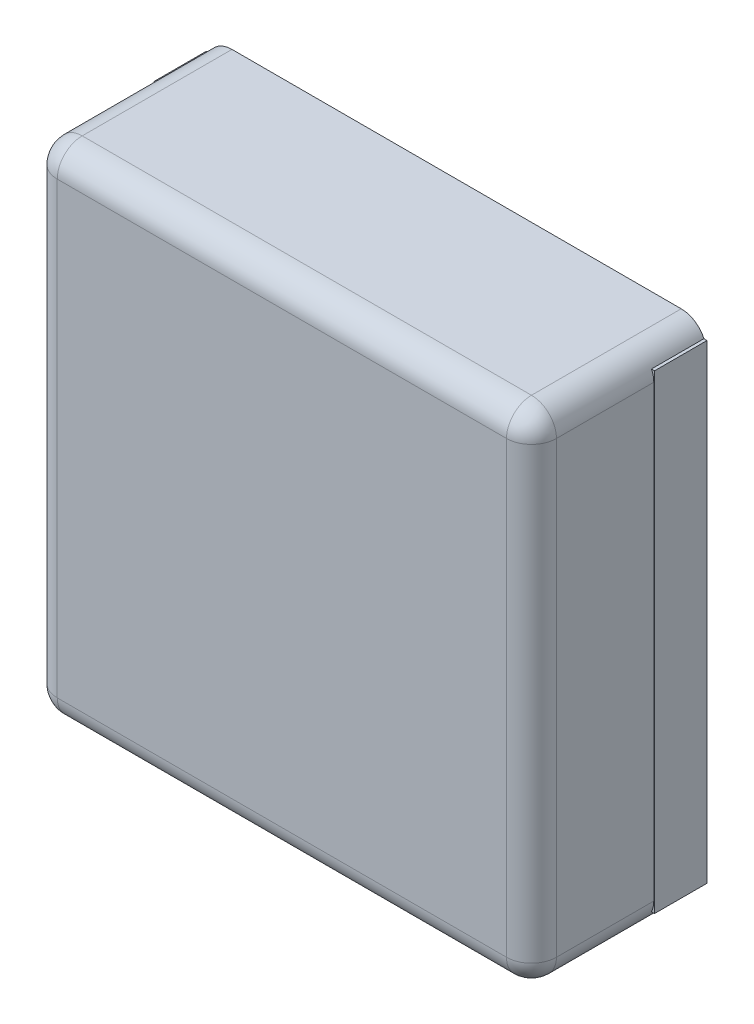
ISO-10303-21;
HEADER;
FILE_DESCRIPTION(('STEP AP214'),'2;1');
FILE_NAME('part.step','',(''),(''),'','','');
FILE_SCHEMA(('AUTOMOTIVE_DESIGN { 1 0 10303 214 1 1 1 1 }'));
ENDSEC;
DATA;
#1=APPLICATION_CONTEXT('core data for automotive mechanical design processes');
#2=APPLICATION_PROTOCOL_DEFINITION('international standard','automotive_design',2000,#1);
#3=PRODUCT_CONTEXT('',#1,'mechanical');
#4=PRODUCT('Part','Part','',(#3));
#5=PRODUCT_RELATED_PRODUCT_CATEGORY('part','',(#4));
#6=PRODUCT_DEFINITION_FORMATION('','',#4);
#7=PRODUCT_DEFINITION_CONTEXT('part definition',#1,'design');
#8=PRODUCT_DEFINITION('design','',#6,#7);
#9=PRODUCT_DEFINITION_SHAPE('','',#8);
#10=(LENGTH_UNIT() NAMED_UNIT(*) SI_UNIT(.MILLI.,.METRE.));
#11=(NAMED_UNIT(*) PLANE_ANGLE_UNIT() SI_UNIT($,.RADIAN.));
#12=(NAMED_UNIT(*) SI_UNIT($,.STERADIAN.) SOLID_ANGLE_UNIT());
#13=UNCERTAINTY_MEASURE_WITH_UNIT(LENGTH_MEASURE(1.E-05),#10,'distance_accuracy_value','');
#14=(GEOMETRIC_REPRESENTATION_CONTEXT(3) GLOBAL_UNCERTAINTY_ASSIGNED_CONTEXT((#13)) GLOBAL_UNIT_ASSIGNED_CONTEXT((#10,
#11,#12)) REPRESENTATION_CONTEXT('',''));
#15=CARTESIAN_POINT('',(0.,0.,0.));
#16=DIRECTION('',(0.,0.,1.));
#17=DIRECTION('',(1.,0.,0.));
#18=AXIS2_PLACEMENT_3D('',#15,#16,#17);
#19=CARTESIAN_POINT('',(3.01,-2.825,0.));
#20=DIRECTION('',(1.,0.,0.));
#21=DIRECTION('',(0.,1.,0.));
#22=AXIS2_PLACEMENT_3D('',#19,#20,#21);
#23=PLANE('',#22);
#24=DIRECTION('',(0.,0.,1.));
#25=VECTOR('',#24,1.);
#26=CARTESIAN_POINT('',(3.01,-2.825,0.));
#27=LINE('',#26,#25);
#28=CARTESIAN_POINT('',(3.01,-2.825,0.));
#29=VERTEX_POINT('',#28);
#30=CARTESIAN_POINT('',(3.01,-2.825,0.63));
#31=VERTEX_POINT('',#30);
#32=EDGE_CURVE('E322',#29,#31,#27,.T.);
#33=ORIENTED_EDGE('',*,*,#32,.F.);
#34=DIRECTION('',(0.,1.,0.));
#35=VECTOR('',#34,1.);
#36=CARTESIAN_POINT('',(3.01,-2.825,0.));
#37=LINE('',#36,#35);
#38=CARTESIAN_POINT('',(3.01,2.825,0.));
#39=VERTEX_POINT('',#38);
#40=EDGE_CURVE('E378',#29,#39,#37,.T.);
#41=ORIENTED_EDGE('',*,*,#40,.T.);
#42=DIRECTION('',(0.,0.,1.));
#43=VECTOR('',#42,1.);
#44=CARTESIAN_POINT('',(3.01,2.825,0.));
#45=LINE('',#44,#43);
#46=CARTESIAN_POINT('',(3.01,2.825,0.63));
#47=VERTEX_POINT('',#46);
#48=EDGE_CURVE('E11',#39,#47,#45,.T.);
#49=ORIENTED_EDGE('',*,*,#48,.T.);
#50=DIRECTION('',(0.,1.,0.));
#51=VECTOR('',#50,1.);
#52=CARTESIAN_POINT('',(3.01,-2.825,0.63));
#53=LINE('',#52,#51);
#54=EDGE_CURVE('E329',#31,#47,#53,.T.);
#55=ORIENTED_EDGE('',*,*,#54,.F.);
#56=EDGE_LOOP('',(#33,#41,#49,#55));
#57=FACE_BOUND('',#56,.T.);
#58=ADVANCED_FACE('F18',(#57),#23,.T.);
#59=CARTESIAN_POINT('',(1.16,2.825,0.));
#60=DIRECTION('',(0.,1.,0.));
#61=DIRECTION('',(1.,0.,0.));
#62=AXIS2_PLACEMENT_3D('',#59,#60,#61);
#63=PLANE('',#62);
#64=DIRECTION('',(1.,0.,0.));
#65=VECTOR('',#64,1.);
#66=CARTESIAN_POINT('',(1.16,2.825,0.));
#67=LINE('',#66,#65);
#68=CARTESIAN_POINT('',(2.972717802866,2.825,0.));
#69=VERTEX_POINT('',#68);
#70=EDGE_CURVE('E291',#69,#39,#67,.T.);
#71=ORIENTED_EDGE('',*,*,#70,.F.);
#72=DIRECTION('',(0.,0.,1.));
#73=VECTOR('',#72,1.);
#74=CARTESIAN_POINT('',(2.972717802866,2.825,0.));
#75=LINE('',#74,#73);
#76=CARTESIAN_POINT('',(2.972717802866,2.825,0.63));
#77=VERTEX_POINT('',#76);
#78=EDGE_CURVE('E292',#69,#77,#75,.T.);
#79=ORIENTED_EDGE('',*,*,#78,.T.);
#80=DIRECTION('',(1.,0.,0.));
#81=VECTOR('',#80,1.);
#82=CARTESIAN_POINT('',(1.16,2.825,0.63));
#83=LINE('',#82,#81);
#84=EDGE_CURVE('E29',#77,#47,#83,.T.);
#85=ORIENTED_EDGE('',*,*,#84,.T.);
#86=ORIENTED_EDGE('',*,*,#48,.F.);
#87=EDGE_LOOP('',(#71,#79,#85,#86));
#88=FACE_BOUND('',#87,.T.);
#89=ADVANCED_FACE('F457',(#88),#63,.T.);
#90=CARTESIAN_POINT('',(2.7,2.7,1.8));
#91=DIRECTION('',(0.,0.,1.));
#92=DIRECTION('',(0.,1.,0.));
#93=AXIS2_PLACEMENT_3D('',#90,#91,#92);
#94=SPHERICAL_SURFACE('',#93,0.3);
#95=CARTESIAN_POINT('',(2.7,2.7,1.8));
#96=DIRECTION('',(0.,-1.,0.));
#97=DIRECTION('',(1.,0.,0.));
#98=AXIS2_PLACEMENT_3D('',#95,#96,#97);
#99=CIRCLE('',#98,0.3);
#100=CARTESIAN_POINT('',(3.,2.7,1.8));
#101=VERTEX_POINT('',#100);
#102=CARTESIAN_POINT('',(2.7,2.7,2.1));
#103=VERTEX_POINT('',#102);
#104=EDGE_CURVE('E219',#101,#103,#99,.T.);
#105=ORIENTED_EDGE('',*,*,#104,.F.);
#106=CARTESIAN_POINT('',(2.7,2.7,1.8));
#107=DIRECTION('',(0.,0.,-1.));
#108=DIRECTION('',(0.,1.,0.));
#109=AXIS2_PLACEMENT_3D('',#106,#107,#108);
#110=CIRCLE('',#109,0.3);
#111=CARTESIAN_POINT('',(2.7,3.,1.8));
#112=VERTEX_POINT('',#111);
#113=EDGE_CURVE('E287',#112,#101,#110,.T.);
#114=ORIENTED_EDGE('',*,*,#113,.F.);
#115=CARTESIAN_POINT('',(2.7,2.7,1.8));
#116=DIRECTION('',(1.,0.,0.));
#117=DIRECTION('',(0.,1.,0.));
#118=AXIS2_PLACEMENT_3D('',#115,#116,#117);
#119=CIRCLE('',#118,0.3);
#120=EDGE_CURVE('E314',#112,#103,#119,.T.);
#121=ORIENTED_EDGE('',*,*,#120,.T.);
#122=EDGE_LOOP('',(#105,#114,#121));
#123=FACE_BOUND('',#122,.T.);
#124=ADVANCED_FACE('F516',(#123),#94,.T.);
#125=CARTESIAN_POINT('',(1.16,-2.825,0.63));
#126=DIRECTION('',(0.,0.,1.));
#127=DIRECTION('',(1.,0.,0.));
#128=AXIS2_PLACEMENT_3D('',#125,#126,#127);
#129=PLANE('',#128);
#130=CARTESIAN_POINT('',(2.7,-2.7,0.63));
#131=DIRECTION('',(0.,0.,1.));
#132=DIRECTION('',(1.,0.,0.));
#133=AXIS2_PLACEMENT_3D('',#130,#131,#132);
#134=CIRCLE('',#133,0.3);
#135=CARTESIAN_POINT('',(2.972717802866,-2.825,0.63));
#136=VERTEX_POINT('',#135);
#137=CARTESIAN_POINT('',(3.,-2.7,0.63));
#138=VERTEX_POINT('',#137);
#139=EDGE_CURVE('E227',#136,#138,#134,.T.);
#140=ORIENTED_EDGE('',*,*,#139,.F.);
#141=DIRECTION('',(1.,0.,0.));
#142=VECTOR('',#141,1.);
#143=CARTESIAN_POINT('',(1.16,-2.825,0.63));
#144=LINE('',#143,#142);
#145=EDGE_CURVE('E326',#136,#31,#144,.T.);
#146=ORIENTED_EDGE('',*,*,#145,.T.);
#147=ORIENTED_EDGE('',*,*,#54,.T.);
#148=ORIENTED_EDGE('',*,*,#84,.F.);
#149=CARTESIAN_POINT('',(2.7,2.7,0.63));
#150=DIRECTION('',(0.,0.,1.));
#151=DIRECTION('',(1.,0.,0.));
#152=AXIS2_PLACEMENT_3D('',#149,#150,#151);
#153=CIRCLE('',#152,0.3);
#154=CARTESIAN_POINT('',(3.,2.7,0.63));
#155=VERTEX_POINT('',#154);
#156=EDGE_CURVE('E308',#155,#77,#153,.T.);
#157=ORIENTED_EDGE('',*,*,#156,.F.);
#158=DIRECTION('',(0.,-1.,0.));
#159=VECTOR('',#158,1.);
#160=CARTESIAN_POINT('',(3.,-2.9125,0.63));
#161=LINE('',#160,#159);
#162=EDGE_CURVE('E206',#155,#138,#161,.T.);
#163=ORIENTED_EDGE('',*,*,#162,.T.);
#164=EDGE_LOOP('',(#140,#146,#147,#148,#157,#163));
#165=FACE_BOUND('',#164,.T.);
#166=ADVANCED_FACE('F482',(#165),#129,.T.);
#167=CARTESIAN_POINT('',(1.16,-2.825,0.));
#168=DIRECTION('',(0.,1.,0.));
#169=DIRECTION('',(1.,0.,0.));
#170=AXIS2_PLACEMENT_3D('',#167,#168,#169);
#171=PLANE('',#170);
#172=ORIENTED_EDGE('',*,*,#32,.T.);
#173=ORIENTED_EDGE('',*,*,#145,.F.);
#174=DIRECTION('',(0.,0.,1.));
#175=VECTOR('',#174,1.);
#176=CARTESIAN_POINT('',(2.972717802866,-2.825,0.));
#177=LINE('',#176,#175);
#178=CARTESIAN_POINT('',(2.972717802866,-2.825,0.));
#179=VERTEX_POINT('',#178);
#180=EDGE_CURVE('E234',#179,#136,#177,.T.);
#181=ORIENTED_EDGE('',*,*,#180,.F.);
#182=DIRECTION('',(1.,0.,0.));
#183=VECTOR('',#182,1.);
#184=CARTESIAN_POINT('',(1.16,-2.825,0.));
#185=LINE('',#184,#183);
#186=EDGE_CURVE('E393',#179,#29,#185,.T.);
#187=ORIENTED_EDGE('',*,*,#186,.T.);
#188=EDGE_LOOP('',(#172,#173,#181,#187));
#189=FACE_BOUND('',#188,.T.);
#190=ADVANCED_FACE('F478',(#189),#171,.F.);
#191=CARTESIAN_POINT('',(3.,-3.,0.));
#192=DIRECTION('',(1.,0.,0.));
#193=DIRECTION('',(0.,1.,0.));
#194=AXIS2_PLACEMENT_3D('',#191,#192,#193);
#195=PLANE('',#194);
#196=DIRECTION('',(0.,0.,1.));
#197=VECTOR('',#196,1.);
#198=CARTESIAN_POINT('',(3.,-2.7,0.));
#199=LINE('',#198,#197);
#200=CARTESIAN_POINT('',(3.,-2.7,1.8));
#201=VERTEX_POINT('',#200);
#202=EDGE_CURVE('E199',#138,#201,#199,.T.);
#203=ORIENTED_EDGE('',*,*,#202,.F.);
#204=ORIENTED_EDGE('',*,*,#162,.F.);
#205=DIRECTION('',(0.,0.,1.));
#206=VECTOR('',#205,1.);
#207=CARTESIAN_POINT('',(3.,2.7,0.));
#208=LINE('',#207,#206);
#209=EDGE_CURVE('E202',#155,#101,#208,.T.);
#210=ORIENTED_EDGE('',*,*,#209,.T.);
#211=DIRECTION('',(0.,-1.,0.));
#212=VECTOR('',#211,1.);
#213=CARTESIAN_POINT('',(3.,2.7,1.8));
#214=LINE('',#213,#212);
#215=EDGE_CURVE('E195',#101,#201,#214,.T.);
#216=ORIENTED_EDGE('',*,*,#215,.T.);
#217=EDGE_LOOP('',(#203,#204,#210,#216));
#218=FACE_BOUND('',#217,.T.);
#219=ADVANCED_FACE('F197',(#218),#195,.T.);
#220=CARTESIAN_POINT('',(2.7,-2.7,1.8));
#221=DIRECTION('',(0.,0.,1.));
#222=DIRECTION('',(1.,0.,0.));
#223=AXIS2_PLACEMENT_3D('',#220,#221,#222);
#224=SPHERICAL_SURFACE('',#223,0.3);
#225=CARTESIAN_POINT('',(2.7,-2.7,1.8));
#226=DIRECTION('',(-1.,0.,0.));
#227=DIRECTION('',(0.,-1.,0.));
#228=AXIS2_PLACEMENT_3D('',#225,#226,#227);
#229=CIRCLE('',#228,0.3);
#230=CARTESIAN_POINT('',(2.7,-3.,1.8));
#231=VERTEX_POINT('',#230);
#232=CARTESIAN_POINT('',(2.7,-2.7,2.1));
#233=VERTEX_POINT('',#232);
#234=EDGE_CURVE('E231',#231,#233,#229,.T.);
#235=ORIENTED_EDGE('',*,*,#234,.F.);
#236=CARTESIAN_POINT('',(2.7,-2.7,1.8));
#237=DIRECTION('',(0.,0.,-1.));
#238=DIRECTION('',(1.,0.,0.));
#239=AXIS2_PLACEMENT_3D('',#236,#237,#238);
#240=CIRCLE('',#239,0.3);
#241=EDGE_CURVE('E224',#201,#231,#240,.T.);
#242=ORIENTED_EDGE('',*,*,#241,.F.);
#243=CARTESIAN_POINT('',(2.7,-2.7,1.8));
#244=DIRECTION('',(0.,-1.,0.));
#245=DIRECTION('',(1.,0.,0.));
#246=AXIS2_PLACEMENT_3D('',#243,#244,#245);
#247=CIRCLE('',#246,0.3);
#248=EDGE_CURVE('E207',#201,#233,#247,.T.);
#249=ORIENTED_EDGE('',*,*,#248,.T.);
#250=EDGE_LOOP('',(#235,#242,#249));
#251=FACE_BOUND('',#250,.T.);
#252=ADVANCED_FACE('F230',(#251),#224,.T.);
#253=CARTESIAN_POINT('',(2.7,2.7,1.8));
#254=DIRECTION('',(0.,-1.,0.));
#255=DIRECTION('',(1.,0.,0.));
#256=AXIS2_PLACEMENT_3D('',#253,#254,#255);
#257=CYLINDRICAL_SURFACE('',#256,0.3);
#258=ORIENTED_EDGE('',*,*,#104,.T.);
#259=DIRECTION('',(0.,-1.,0.));
#260=VECTOR('',#259,1.);
#261=CARTESIAN_POINT('',(2.7,2.7,2.1));
#262=LINE('',#261,#260);
#263=EDGE_CURVE('E212',#103,#233,#262,.T.);
#264=ORIENTED_EDGE('',*,*,#263,.T.);
#265=ORIENTED_EDGE('',*,*,#248,.F.);
#266=ORIENTED_EDGE('',*,*,#215,.F.);
#267=EDGE_LOOP('',(#258,#264,#265,#266));
#268=FACE_BOUND('',#267,.T.);
#269=ADVANCED_FACE('F210',(#268),#257,.T.);
#270=CARTESIAN_POINT('',(-2.7,2.7,1.8));
#271=DIRECTION('',(1.,0.,0.));
#272=DIRECTION('',(0.,1.,0.));
#273=AXIS2_PLACEMENT_3D('',#270,#271,#272);
#274=CYLINDRICAL_SURFACE('',#273,0.3);
#275=CARTESIAN_POINT('',(-2.7,2.7,1.8));
#276=DIRECTION('',(1.,0.,0.));
#277=DIRECTION('',(0.,1.,0.));
#278=AXIS2_PLACEMENT_3D('',#275,#276,#277);
#279=CIRCLE('',#278,0.3);
#280=CARTESIAN_POINT('',(-2.7,3.,1.8));
#281=VERTEX_POINT('',#280);
#282=CARTESIAN_POINT('',(-2.7,2.7,2.1));
#283=VERTEX_POINT('',#282);
#284=EDGE_CURVE('E22',#281,#283,#279,.T.);
#285=ORIENTED_EDGE('',*,*,#284,.T.);
#286=DIRECTION('',(1.,0.,0.));
#287=VECTOR('',#286,1.);
#288=CARTESIAN_POINT('',(-2.7,2.7,2.1));
#289=LINE('',#288,#287);
#290=EDGE_CURVE('E265',#283,#103,#289,.T.);
#291=ORIENTED_EDGE('',*,*,#290,.T.);
#292=ORIENTED_EDGE('',*,*,#120,.F.);
#293=DIRECTION('',(1.,0.,0.));
#294=VECTOR('',#293,1.);
#295=CARTESIAN_POINT('',(-2.7,3.,1.8));
#296=LINE('',#295,#294);
#297=EDGE_CURVE('E258',#281,#112,#296,.T.);
#298=ORIENTED_EDGE('',*,*,#297,.F.);
#299=EDGE_LOOP('',(#285,#291,#292,#298));
#300=FACE_BOUND('',#299,.T.);
#301=ADVANCED_FACE('F445',(#300),#274,.T.);
#302=CARTESIAN_POINT('',(1.16,-2.825,0.));
#303=DIRECTION('',(0.,0.,1.));
#304=DIRECTION('',(1.,0.,0.));
#305=AXIS2_PLACEMENT_3D('',#302,#303,#304);
#306=PLANE('',#305);
#307=DIRECTION('',(1.,0.,0.));
#308=VECTOR('',#307,1.);
#309=CARTESIAN_POINT('',(1.16,2.825,0.));
#310=LINE('',#309,#308);
#311=CARTESIAN_POINT('',(1.16,2.825,0.));
#312=VERTEX_POINT('',#311);
#313=EDGE_CURVE('E267',#312,#69,#310,.T.);
#314=ORIENTED_EDGE('',*,*,#313,.T.);
#315=ORIENTED_EDGE('',*,*,#70,.T.);
#316=ORIENTED_EDGE('',*,*,#40,.F.);
#317=ORIENTED_EDGE('',*,*,#186,.F.);
#318=DIRECTION('',(1.,0.,0.));
#319=VECTOR('',#318,1.);
#320=CARTESIAN_POINT('',(1.16,-2.825,0.));
#321=LINE('',#320,#319);
#322=CARTESIAN_POINT('',(1.16,-2.825,0.));
#323=VERTEX_POINT('',#322);
#324=EDGE_CURVE('E799',#323,#179,#321,.T.);
#325=ORIENTED_EDGE('',*,*,#324,.F.);
#326=DIRECTION('',(0.,1.,0.));
#327=VECTOR('',#326,1.);
#328=CARTESIAN_POINT('',(1.16,-2.825,0.));
#329=LINE('',#328,#327);
#330=EDGE_CURVE('E270',#323,#312,#329,.T.);
#331=ORIENTED_EDGE('',*,*,#330,.T.);
#332=EDGE_LOOP('',(#314,#315,#316,#317,#325,#331));
#333=FACE_BOUND('',#332,.T.);
#334=ADVANCED_FACE('F493',(#333),#306,.F.);
#335=CARTESIAN_POINT('',(2.7,2.7,0.));
#336=DIRECTION('',(0.,0.,1.));
#337=DIRECTION('',(1.,0.,0.));
#338=AXIS2_PLACEMENT_3D('',#335,#336,#337);
#339=CYLINDRICAL_SURFACE('',#338,0.3);
#340=ORIENTED_EDGE('',*,*,#209,.F.);
#341=ORIENTED_EDGE('',*,*,#156,.T.);
#342=ORIENTED_EDGE('',*,*,#78,.F.);
#343=CARTESIAN_POINT('',(2.7,2.7,0.));
#344=DIRECTION('',(0.,0.,1.));
#345=DIRECTION('',(0.,-1.,0.));
#346=AXIS2_PLACEMENT_3D('',#343,#344,#345);
#347=CIRCLE('',#346,0.3);
#348=CARTESIAN_POINT('',(2.7,3.,0.));
#349=VERTEX_POINT('',#348);
#350=EDGE_CURVE('E271',#69,#349,#347,.T.);
#351=ORIENTED_EDGE('',*,*,#350,.T.);
#352=DIRECTION('',(0.,0.,1.));
#353=VECTOR('',#352,1.);
#354=CARTESIAN_POINT('',(2.7,3.,0.));
#355=LINE('',#354,#353);
#356=EDGE_CURVE('E262',#349,#112,#355,.T.);
#357=ORIENTED_EDGE('',*,*,#356,.T.);
#358=ORIENTED_EDGE('',*,*,#113,.T.);
#359=EDGE_LOOP('',(#340,#341,#342,#351,#357,#358));
#360=FACE_BOUND('',#359,.T.);
#361=ADVANCED_FACE('F488',(#360),#339,.T.);
#362=CARTESIAN_POINT('',(-3.01,-2.825,0.));
#363=DIRECTION('',(0.,0.,1.));
#364=DIRECTION('',(1.,0.,0.));
#365=AXIS2_PLACEMENT_3D('',#362,#363,#364);
#366=PLANE('',#365);
#367=DIRECTION('',(1.,0.,0.));
#368=VECTOR('',#367,1.);
#369=CARTESIAN_POINT('',(-3.01,2.825,0.));
#370=LINE('',#369,#368);
#371=CARTESIAN_POINT('',(-3.01,2.825,0.));
#372=VERTEX_POINT('',#371);
#373=CARTESIAN_POINT('',(-2.972717802866,2.825,0.));
#374=VERTEX_POINT('',#373);
#375=EDGE_CURVE('E246',#372,#374,#370,.T.);
#376=ORIENTED_EDGE('',*,*,#375,.T.);
#377=DIRECTION('',(1.,0.,0.));
#378=VECTOR('',#377,1.);
#379=CARTESIAN_POINT('',(-3.01,2.825,0.));
#380=LINE('',#379,#378);
#381=CARTESIAN_POINT('',(-1.16,2.825,0.));
#382=VERTEX_POINT('',#381);
#383=EDGE_CURVE('E298',#374,#382,#380,.T.);
#384=ORIENTED_EDGE('',*,*,#383,.T.);
#385=DIRECTION('',(0.,1.,0.));
#386=VECTOR('',#385,1.);
#387=CARTESIAN_POINT('',(-1.16,-2.825,0.));
#388=LINE('',#387,#386);
#389=CARTESIAN_POINT('',(-1.16,-2.825,0.));
#390=VERTEX_POINT('',#389);
#391=EDGE_CURVE('E296',#390,#382,#388,.T.);
#392=ORIENTED_EDGE('',*,*,#391,.F.);
#393=DIRECTION('',(1.,0.,0.));
#394=VECTOR('',#393,1.);
#395=CARTESIAN_POINT('',(-3.01,-2.825,0.));
#396=LINE('',#395,#394);
#397=CARTESIAN_POINT('',(-2.972717802866,-2.825,0.));
#398=VERTEX_POINT('',#397);
#399=EDGE_CURVE('E257',#398,#390,#396,.T.);
#400=ORIENTED_EDGE('',*,*,#399,.F.);
#401=DIRECTION('',(1.,0.,0.));
#402=VECTOR('',#401,1.);
#403=CARTESIAN_POINT('',(-3.01,-2.825,0.));
#404=LINE('',#403,#402);
#405=CARTESIAN_POINT('',(-3.01,-2.825,0.));
#406=VERTEX_POINT('',#405);
#407=EDGE_CURVE('E256',#406,#398,#404,.T.);
#408=ORIENTED_EDGE('',*,*,#407,.F.);
#409=DIRECTION('',(0.,1.,0.));
#410=VECTOR('',#409,1.);
#411=CARTESIAN_POINT('',(-3.01,-2.825,0.));
#412=LINE('',#411,#410);
#413=EDGE_CURVE('E242',#406,#372,#412,.T.);
#414=ORIENTED_EDGE('',*,*,#413,.T.);
#415=EDGE_LOOP('',(#376,#384,#392,#400,#408,#414));
#416=FACE_BOUND('',#415,.T.);
#417=ADVANCED_FACE('F492',(#416),#366,.F.);
#418=CARTESIAN_POINT('',(2.7,-2.7,0.));
#419=DIRECTION('',(0.,0.,1.));
#420=DIRECTION('',(1.,0.,0.));
#421=AXIS2_PLACEMENT_3D('',#418,#419,#420);
#422=CYLINDRICAL_SURFACE('',#421,0.3);
#423=ORIENTED_EDGE('',*,*,#241,.T.);
#424=DIRECTION('',(0.,0.,1.));
#425=VECTOR('',#424,1.);
#426=CARTESIAN_POINT('',(2.7,-3.,0.));
#427=LINE('',#426,#425);
#428=CARTESIAN_POINT('',(2.7,-3.,0.));
#429=VERTEX_POINT('',#428);
#430=EDGE_CURVE('E297',#429,#231,#427,.T.);
#431=ORIENTED_EDGE('',*,*,#430,.F.);
#432=CARTESIAN_POINT('',(2.7,-2.7,0.));
#433=DIRECTION('',(0.,0.,-1.));
#434=DIRECTION('',(0.,-1.,0.));
#435=AXIS2_PLACEMENT_3D('',#432,#433,#434);
#436=CIRCLE('',#435,0.3);
#437=EDGE_CURVE('E368',#179,#429,#436,.T.);
#438=ORIENTED_EDGE('',*,*,#437,.F.);
#439=ORIENTED_EDGE('',*,*,#180,.T.);
#440=ORIENTED_EDGE('',*,*,#139,.T.);
#441=ORIENTED_EDGE('',*,*,#202,.T.);
#442=EDGE_LOOP('',(#423,#431,#438,#439,#440,#441));
#443=FACE_BOUND('',#442,.T.);
#444=ADVANCED_FACE('F222',(#443),#422,.T.);
#445=CARTESIAN_POINT('',(2.7,-2.7,1.8));
#446=DIRECTION('',(-1.,0.,0.));
#447=DIRECTION('',(0.,-1.,0.));
#448=AXIS2_PLACEMENT_3D('',#445,#446,#447);
#449=CYLINDRICAL_SURFACE('',#448,0.3);
#450=ORIENTED_EDGE('',*,*,#234,.T.);
#451=DIRECTION('',(-1.,0.,0.));
#452=VECTOR('',#451,1.);
#453=CARTESIAN_POINT('',(2.7,-2.7,2.1));
#454=LINE('',#453,#452);
#455=CARTESIAN_POINT('',(-2.7,-2.7,2.1));
#456=VERTEX_POINT('',#455);
#457=EDGE_CURVE('E266',#233,#456,#454,.T.);
#458=ORIENTED_EDGE('',*,*,#457,.T.);
#459=CARTESIAN_POINT('',(-2.7,-2.7,1.8));
#460=DIRECTION('',(-1.,0.,0.));
#461=DIRECTION('',(0.,-1.,0.));
#462=AXIS2_PLACEMENT_3D('',#459,#460,#461);
#463=CIRCLE('',#462,0.3);
#464=CARTESIAN_POINT('',(-2.7,-3.,1.8));
#465=VERTEX_POINT('',#464);
#466=EDGE_CURVE('E310',#465,#456,#463,.T.);
#467=ORIENTED_EDGE('',*,*,#466,.F.);
#468=DIRECTION('',(-1.,0.,0.));
#469=VECTOR('',#468,1.);
#470=CARTESIAN_POINT('',(2.7,-3.,1.8));
#471=LINE('',#470,#469);
#472=EDGE_CURVE('E293',#231,#465,#471,.T.);
#473=ORIENTED_EDGE('',*,*,#472,.F.);
#474=EDGE_LOOP('',(#450,#458,#467,#473));
#475=FACE_BOUND('',#474,.T.);
#476=ADVANCED_FACE('F543',(#475),#449,.T.);
#477=CARTESIAN_POINT('',(-3.01,-2.825,0.));
#478=DIRECTION('',(1.,0.,0.));
#479=DIRECTION('',(0.,1.,0.));
#480=AXIS2_PLACEMENT_3D('',#477,#478,#479);
#481=PLANE('',#480);
#482=DIRECTION('',(0.,1.,0.));
#483=VECTOR('',#482,1.);
#484=CARTESIAN_POINT('',(-3.01,-2.825,0.63));
#485=LINE('',#484,#483);
#486=CARTESIAN_POINT('',(-3.01,-2.825,0.63));
#487=VERTEX_POINT('',#486);
#488=CARTESIAN_POINT('',(-3.01,2.825,0.63));
#489=VERTEX_POINT('',#488);
#490=EDGE_CURVE('E248',#487,#489,#485,.T.);
#491=ORIENTED_EDGE('',*,*,#490,.T.);
#492=DIRECTION('',(0.,0.,1.));
#493=VECTOR('',#492,1.);
#494=CARTESIAN_POINT('',(-3.01,2.825,0.));
#495=LINE('',#494,#493);
#496=EDGE_CURVE('E388',#372,#489,#495,.T.);
#497=ORIENTED_EDGE('',*,*,#496,.F.);
#498=ORIENTED_EDGE('',*,*,#413,.F.);
#499=DIRECTION('',(0.,0.,1.));
#500=VECTOR('',#499,1.);
#501=CARTESIAN_POINT('',(-3.01,-2.825,0.));
#502=LINE('',#501,#500);
#503=EDGE_CURVE('E253',#406,#487,#502,.T.);
#504=ORIENTED_EDGE('',*,*,#503,.T.);
#505=EDGE_LOOP('',(#491,#497,#498,#504));
#506=FACE_BOUND('',#505,.T.);
#507=ADVANCED_FACE('F547',(#506),#481,.F.);
#508=CARTESIAN_POINT('',(-3.01,2.825,0.));
#509=DIRECTION('',(0.,1.,0.));
#510=DIRECTION('',(1.,0.,0.));
#511=AXIS2_PLACEMENT_3D('',#508,#509,#510);
#512=PLANE('',#511);
#513=ORIENTED_EDGE('',*,*,#375,.F.);
#514=ORIENTED_EDGE('',*,*,#496,.T.);
#515=DIRECTION('',(1.,0.,0.));
#516=VECTOR('',#515,1.);
#517=CARTESIAN_POINT('',(-3.01,2.825,0.63));
#518=LINE('',#517,#516);
#519=CARTESIAN_POINT('',(-2.972717802866,2.825,0.63));
#520=VERTEX_POINT('',#519);
#521=EDGE_CURVE('E252',#489,#520,#518,.T.);
#522=ORIENTED_EDGE('',*,*,#521,.T.);
#523=DIRECTION('',(0.,0.,1.));
#524=VECTOR('',#523,1.);
#525=CARTESIAN_POINT('',(-2.972717802866,2.825,0.));
#526=LINE('',#525,#524);
#527=EDGE_CURVE('E281',#374,#520,#526,.T.);
#528=ORIENTED_EDGE('',*,*,#527,.F.);
#529=EDGE_LOOP('',(#513,#514,#522,#528));
#530=FACE_BOUND('',#529,.T.);
#531=ADVANCED_FACE('F571',(#530),#512,.T.);
#532=CARTESIAN_POINT('',(-3.,3.,0.));
#533=DIRECTION('',(0.,1.,0.));
#534=DIRECTION('',(1.,0.,0.));
#535=AXIS2_PLACEMENT_3D('',#532,#533,#534);
#536=PLANE('',#535);
#537=DIRECTION('',(0.,0.,1.));
#538=VECTOR('',#537,1.);
#539=CARTESIAN_POINT('',(-2.7,3.,0.));
#540=LINE('',#539,#538);
#541=CARTESIAN_POINT('',(-2.7,3.,0.));
#542=VERTEX_POINT('',#541);
#543=EDGE_CURVE('E334',#542,#281,#540,.T.);
#544=ORIENTED_EDGE('',*,*,#543,.T.);
#545=ORIENTED_EDGE('',*,*,#297,.T.);
#546=ORIENTED_EDGE('',*,*,#356,.F.);
#547=DIRECTION('',(1.,0.,0.));
#548=VECTOR('',#547,1.);
#549=CARTESIAN_POINT('',(-3.,3.,0.));
#550=LINE('',#549,#548);
#551=EDGE_CURVE('E301',#542,#349,#550,.T.);
#552=ORIENTED_EDGE('',*,*,#551,.F.);
#553=EDGE_LOOP('',(#544,#545,#546,#552));
#554=FACE_BOUND('',#553,.T.);
#555=ADVANCED_FACE('F647',(#554),#536,.T.);
#556=CARTESIAN_POINT('',(-2.7,2.7,1.8));
#557=DIRECTION('',(0.,0.,1.));
#558=DIRECTION('',(-1.,0.,0.));
#559=AXIS2_PLACEMENT_3D('',#556,#557,#558);
#560=SPHERICAL_SURFACE('',#559,0.3);
#561=ORIENTED_EDGE('',*,*,#284,.F.);
#562=CARTESIAN_POINT('',(-2.7,2.7,1.8));
#563=DIRECTION('',(0.,0.,-1.));
#564=DIRECTION('',(-1.,0.,0.));
#565=AXIS2_PLACEMENT_3D('',#562,#563,#564);
#566=CIRCLE('',#565,0.3);
#567=CARTESIAN_POINT('',(-3.,2.7,1.8));
#568=VERTEX_POINT('',#567);
#569=EDGE_CURVE('E353',#568,#281,#566,.T.);
#570=ORIENTED_EDGE('',*,*,#569,.F.);
#571=CARTESIAN_POINT('',(-2.7,2.7,1.8));
#572=DIRECTION('',(0.,1.,0.));
#573=DIRECTION('',(-1.,0.,0.));
#574=AXIS2_PLACEMENT_3D('',#571,#572,#573);
#575=CIRCLE('',#574,0.3);
#576=EDGE_CURVE('E277',#568,#283,#575,.T.);
#577=ORIENTED_EDGE('',*,*,#576,.T.);
#578=EDGE_LOOP('',(#561,#570,#577));
#579=FACE_BOUND('',#578,.T.);
#580=ADVANCED_FACE('F20',(#579),#560,.T.);
#581=CARTESIAN_POINT('',(-3.,-3.,2.1));
#582=DIRECTION('',(0.,0.,1.));
#583=DIRECTION('',(1.,0.,0.));
#584=AXIS2_PLACEMENT_3D('',#581,#582,#583);
#585=PLANE('',#584);
#586=DIRECTION('',(0.,1.,0.));
#587=VECTOR('',#586,1.);
#588=CARTESIAN_POINT('',(-2.7,-2.7,2.1));
#589=LINE('',#588,#587);
#590=EDGE_CURVE('E273',#456,#283,#589,.T.);
#591=ORIENTED_EDGE('',*,*,#590,.F.);
#592=ORIENTED_EDGE('',*,*,#457,.F.);
#593=ORIENTED_EDGE('',*,*,#263,.F.);
#594=ORIENTED_EDGE('',*,*,#290,.F.);
#595=EDGE_LOOP('',(#591,#592,#593,#594));
#596=FACE_BOUND('',#595,.T.);
#597=ADVANCED_FACE('F443',(#596),#585,.T.);
#598=CARTESIAN_POINT('',(-3.01,-2.825,0.));
#599=DIRECTION('',(0.,1.,0.));
#600=DIRECTION('',(1.,0.,0.));
#601=AXIS2_PLACEMENT_3D('',#598,#599,#600);
#602=PLANE('',#601);
#603=DIRECTION('',(0.,0.,1.));
#604=VECTOR('',#603,1.);
#605=CARTESIAN_POINT('',(-2.972717802866,-2.825,0.));
#606=LINE('',#605,#604);
#607=CARTESIAN_POINT('',(-2.972717802866,-2.825,0.63));
#608=VERTEX_POINT('',#607);
#609=EDGE_CURVE('E430',#398,#608,#606,.T.);
#610=ORIENTED_EDGE('',*,*,#609,.T.);
#611=DIRECTION('',(1.,0.,0.));
#612=VECTOR('',#611,1.);
#613=CARTESIAN_POINT('',(-3.01,-2.825,0.63));
#614=LINE('',#613,#612);
#615=EDGE_CURVE('E251',#487,#608,#614,.T.);
#616=ORIENTED_EDGE('',*,*,#615,.F.);
#617=ORIENTED_EDGE('',*,*,#503,.F.);
#618=ORIENTED_EDGE('',*,*,#407,.T.);
#619=EDGE_LOOP('',(#610,#616,#617,#618));
#620=FACE_BOUND('',#619,.T.);
#621=ADVANCED_FACE('F466',(#620),#602,.F.);
#622=CARTESIAN_POINT('',(-3.,-3.,0.));
#623=DIRECTION('',(0.,0.,1.));
#624=DIRECTION('',(1.,0.,0.));
#625=AXIS2_PLACEMENT_3D('',#622,#623,#624);
#626=PLANE('',#625);
#627=ORIENTED_EDGE('',*,*,#391,.T.);
#628=ORIENTED_EDGE('',*,*,#383,.F.);
#629=CARTESIAN_POINT('',(-2.7,2.7,0.));
#630=DIRECTION('',(0.,0.,-1.));
#631=DIRECTION('',(0.,-1.,0.));
#632=AXIS2_PLACEMENT_3D('',#629,#630,#631);
#633=CIRCLE('',#632,0.3);
#634=EDGE_CURVE('E330',#374,#542,#633,.T.);
#635=ORIENTED_EDGE('',*,*,#634,.T.);
#636=ORIENTED_EDGE('',*,*,#551,.T.);
#637=ORIENTED_EDGE('',*,*,#350,.F.);
#638=ORIENTED_EDGE('',*,*,#313,.F.);
#639=ORIENTED_EDGE('',*,*,#330,.F.);
#640=ORIENTED_EDGE('',*,*,#324,.T.);
#641=ORIENTED_EDGE('',*,*,#437,.T.);
#642=DIRECTION('',(1.,0.,0.));
#643=VECTOR('',#642,1.);
#644=CARTESIAN_POINT('',(-3.,-3.,0.));
#645=LINE('',#644,#643);
#646=CARTESIAN_POINT('',(-2.7,-3.,0.));
#647=VERTEX_POINT('',#646);
#648=EDGE_CURVE('E375',#647,#429,#645,.T.);
#649=ORIENTED_EDGE('',*,*,#648,.F.);
#650=CARTESIAN_POINT('',(-2.7,-2.7,0.));
#651=DIRECTION('',(0.,0.,1.));
#652=DIRECTION('',(0.,-1.,0.));
#653=AXIS2_PLACEMENT_3D('',#650,#651,#652);
#654=CIRCLE('',#653,0.3);
#655=EDGE_CURVE('E794',#398,#647,#654,.T.);
#656=ORIENTED_EDGE('',*,*,#655,.F.);
#657=ORIENTED_EDGE('',*,*,#399,.T.);
#658=EDGE_LOOP('',(#627,#628,#635,#636,#637,#638,#639,#640,#641,#649,#656,#657));
#659=FACE_BOUND('',#658,.T.);
#660=ADVANCED_FACE('F607',(#659),#626,.F.);
#661=CARTESIAN_POINT('',(-3.,-3.,0.));
#662=DIRECTION('',(0.,1.,0.));
#663=DIRECTION('',(1.,0.,0.));
#664=AXIS2_PLACEMENT_3D('',#661,#662,#663);
#665=PLANE('',#664);
#666=ORIENTED_EDGE('',*,*,#648,.T.);
#667=ORIENTED_EDGE('',*,*,#430,.T.);
#668=ORIENTED_EDGE('',*,*,#472,.T.);
#669=DIRECTION('',(0.,0.,1.));
#670=VECTOR('',#669,1.);
#671=CARTESIAN_POINT('',(-2.7,-3.,0.));
#672=LINE('',#671,#670);
#673=EDGE_CURVE('E321',#647,#465,#672,.T.);
#674=ORIENTED_EDGE('',*,*,#673,.F.);
#675=EDGE_LOOP('',(#666,#667,#668,#674));
#676=FACE_BOUND('',#675,.T.);
#677=ADVANCED_FACE('F580',(#676),#665,.F.);
#678=CARTESIAN_POINT('',(-2.7,-2.7,1.8));
#679=DIRECTION('',(0.,0.,1.));
#680=DIRECTION('',(0.,-1.,0.));
#681=AXIS2_PLACEMENT_3D('',#678,#679,#680);
#682=SPHERICAL_SURFACE('',#681,0.3);
#683=CARTESIAN_POINT('',(-2.7,-2.7,1.8));
#684=DIRECTION('',(0.,1.,0.));
#685=DIRECTION('',(-1.,0.,0.));
#686=AXIS2_PLACEMENT_3D('',#683,#684,#685);
#687=CIRCLE('',#686,0.3);
#688=CARTESIAN_POINT('',(-3.,-2.7,1.8));
#689=VERTEX_POINT('',#688);
#690=EDGE_CURVE('E278',#689,#456,#687,.T.);
#691=ORIENTED_EDGE('',*,*,#690,.F.);
#692=CARTESIAN_POINT('',(-2.7,-2.7,1.8));
#693=DIRECTION('',(0.,0.,-1.));
#694=DIRECTION('',(0.,-1.,0.));
#695=AXIS2_PLACEMENT_3D('',#692,#693,#694);
#696=CIRCLE('',#695,0.3);
#697=EDGE_CURVE('E286',#465,#689,#696,.T.);
#698=ORIENTED_EDGE('',*,*,#697,.F.);
#699=ORIENTED_EDGE('',*,*,#466,.T.);
#700=EDGE_LOOP('',(#691,#698,#699));
#701=FACE_BOUND('',#700,.T.);
#702=ADVANCED_FACE('F438',(#701),#682,.T.);
#703=CARTESIAN_POINT('',(-3.01,-2.825,0.63));
#704=DIRECTION('',(0.,0.,1.));
#705=DIRECTION('',(1.,0.,0.));
#706=AXIS2_PLACEMENT_3D('',#703,#704,#705);
#707=PLANE('',#706);
#708=ORIENTED_EDGE('',*,*,#521,.F.);
#709=ORIENTED_EDGE('',*,*,#490,.F.);
#710=ORIENTED_EDGE('',*,*,#615,.T.);
#711=CARTESIAN_POINT('',(-2.7,-2.7,0.63));
#712=DIRECTION('',(0.,0.,1.));
#713=DIRECTION('',(-1.,0.,0.));
#714=AXIS2_PLACEMENT_3D('',#711,#712,#713);
#715=CIRCLE('',#714,0.3);
#716=CARTESIAN_POINT('',(-3.,-2.7,0.63));
#717=VERTEX_POINT('',#716);
#718=EDGE_CURVE('E347',#717,#608,#715,.T.);
#719=ORIENTED_EDGE('',*,*,#718,.F.);
#720=DIRECTION('',(0.,-1.,0.));
#721=VECTOR('',#720,1.);
#722=CARTESIAN_POINT('',(-3.,-2.9125,0.63));
#723=LINE('',#722,#721);
#724=CARTESIAN_POINT('',(-3.,2.7,0.63));
#725=VERTEX_POINT('',#724);
#726=EDGE_CURVE('E335',#725,#717,#723,.T.);
#727=ORIENTED_EDGE('',*,*,#726,.F.);
#728=CARTESIAN_POINT('',(-2.7,2.7,0.63));
#729=DIRECTION('',(0.,0.,1.));
#730=DIRECTION('',(-1.,0.,0.));
#731=AXIS2_PLACEMENT_3D('',#728,#729,#730);
#732=CIRCLE('',#731,0.3);
#733=EDGE_CURVE('E279',#520,#725,#732,.T.);
#734=ORIENTED_EDGE('',*,*,#733,.F.);
#735=EDGE_LOOP('',(#708,#709,#710,#719,#727,#734));
#736=FACE_BOUND('',#735,.T.);
#737=ADVANCED_FACE('F422',(#736),#707,.T.);
#738=CARTESIAN_POINT('',(-2.7,2.7,0.));
#739=DIRECTION('',(0.,0.,1.));
#740=DIRECTION('',(-1.,0.,0.));
#741=AXIS2_PLACEMENT_3D('',#738,#739,#740);
#742=CYLINDRICAL_SURFACE('',#741,0.3);
#743=ORIENTED_EDGE('',*,*,#569,.T.);
#744=ORIENTED_EDGE('',*,*,#543,.F.);
#745=ORIENTED_EDGE('',*,*,#634,.F.);
#746=ORIENTED_EDGE('',*,*,#527,.T.);
#747=ORIENTED_EDGE('',*,*,#733,.T.);
#748=DIRECTION('',(0.,0.,1.));
#749=VECTOR('',#748,1.);
#750=CARTESIAN_POINT('',(-3.,2.7,0.));
#751=LINE('',#750,#749);
#752=EDGE_CURVE('E339',#725,#568,#751,.T.);
#753=ORIENTED_EDGE('',*,*,#752,.T.);
#754=EDGE_LOOP('',(#743,#744,#745,#746,#747,#753));
#755=FACE_BOUND('',#754,.T.);
#756=ADVANCED_FACE('F413',(#755),#742,.T.);
#757=CARTESIAN_POINT('',(-2.7,-2.7,1.8));
#758=DIRECTION('',(0.,1.,0.));
#759=DIRECTION('',(-1.,0.,0.));
#760=AXIS2_PLACEMENT_3D('',#757,#758,#759);
#761=CYLINDRICAL_SURFACE('',#760,0.3);
#762=ORIENTED_EDGE('',*,*,#690,.T.);
#763=ORIENTED_EDGE('',*,*,#590,.T.);
#764=ORIENTED_EDGE('',*,*,#576,.F.);
#765=DIRECTION('',(0.,1.,0.));
#766=VECTOR('',#765,1.);
#767=CARTESIAN_POINT('',(-3.,-2.7,1.8));
#768=LINE('',#767,#766);
#769=EDGE_CURVE('E357',#689,#568,#768,.T.);
#770=ORIENTED_EDGE('',*,*,#769,.F.);
#771=EDGE_LOOP('',(#762,#763,#764,#770));
#772=FACE_BOUND('',#771,.T.);
#773=ADVANCED_FACE('F407',(#772),#761,.T.);
#774=CARTESIAN_POINT('',(-2.7,-2.7,0.));
#775=DIRECTION('',(0.,0.,1.));
#776=DIRECTION('',(-1.,0.,0.));
#777=AXIS2_PLACEMENT_3D('',#774,#775,#776);
#778=CYLINDRICAL_SURFACE('',#777,0.3);
#779=DIRECTION('',(0.,0.,1.));
#780=VECTOR('',#779,1.);
#781=CARTESIAN_POINT('',(-3.,-2.7,0.));
#782=LINE('',#781,#780);
#783=EDGE_CURVE('E338',#717,#689,#782,.T.);
#784=ORIENTED_EDGE('',*,*,#783,.F.);
#785=ORIENTED_EDGE('',*,*,#718,.T.);
#786=ORIENTED_EDGE('',*,*,#609,.F.);
#787=ORIENTED_EDGE('',*,*,#655,.T.);
#788=ORIENTED_EDGE('',*,*,#673,.T.);
#789=ORIENTED_EDGE('',*,*,#697,.T.);
#790=EDGE_LOOP('',(#784,#785,#786,#787,#788,#789));
#791=FACE_BOUND('',#790,.T.);
#792=ADVANCED_FACE('F432',(#791),#778,.T.);
#793=CARTESIAN_POINT('',(-3.,-3.,0.));
#794=DIRECTION('',(1.,0.,0.));
#795=DIRECTION('',(0.,1.,0.));
#796=AXIS2_PLACEMENT_3D('',#793,#794,#795);
#797=PLANE('',#796);
#798=ORIENTED_EDGE('',*,*,#769,.T.);
#799=ORIENTED_EDGE('',*,*,#752,.F.);
#800=ORIENTED_EDGE('',*,*,#726,.T.);
#801=ORIENTED_EDGE('',*,*,#783,.T.);
#802=EDGE_LOOP('',(#798,#799,#800,#801));
#803=FACE_BOUND('',#802,.T.);
#804=ADVANCED_FACE('F403',(#803),#797,.F.);
#805=CLOSED_SHELL('',(#58,#89,#124,#166,#190,#219,#252,#269,#301,#334,#361,#417,#444,#476,#507,
#531,#555,#580,#597,#621,#660,#677,#702,#737,#756,#773,#792,#804));
#806=MANIFOLD_SOLID_BREP('B1',#805);
#807=ADVANCED_BREP_SHAPE_REPRESENTATION('',(#18,#806),#14);
#808=SHAPE_DEFINITION_REPRESENTATION(#9,#807);
ENDSEC;
END-ISO-10303-21;
